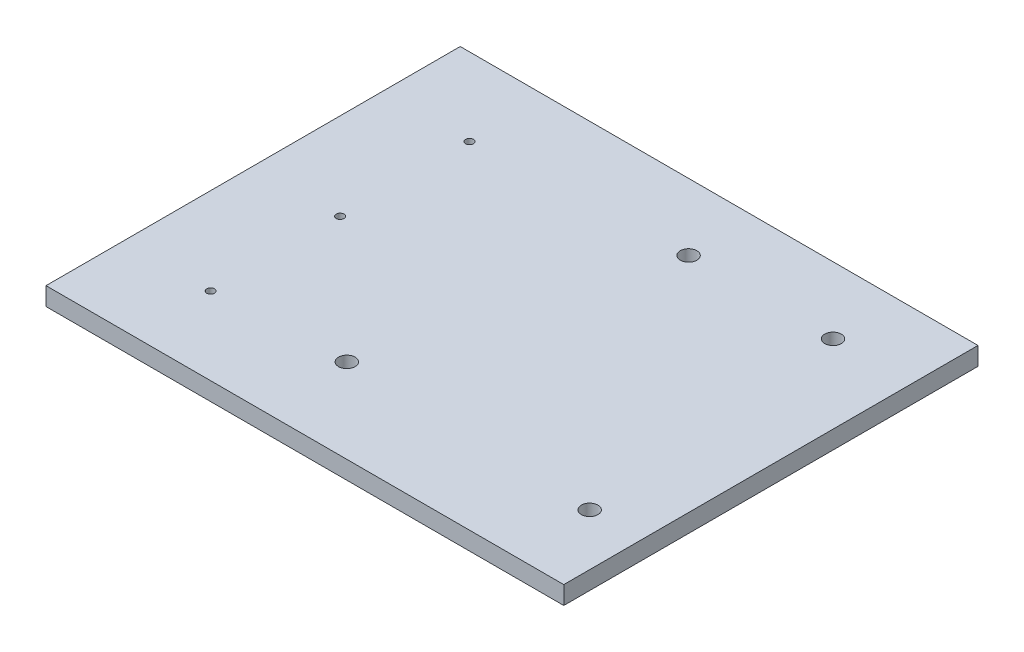
ISO-10303-21;
HEADER;
FILE_DESCRIPTION(('STEP AP214'),'2;1');
FILE_NAME('part.step','',(''),(''),'','','');
FILE_SCHEMA(('AUTOMOTIVE_DESIGN { 1 0 10303 214 1 1 1 1 }'));
ENDSEC;
DATA;
#1=APPLICATION_CONTEXT('core data for automotive mechanical design processes');
#2=APPLICATION_PROTOCOL_DEFINITION('international standard','automotive_design',2000,#1);
#3=PRODUCT_CONTEXT('',#1,'mechanical');
#4=PRODUCT('Part','Part','',(#3));
#5=PRODUCT_RELATED_PRODUCT_CATEGORY('part','',(#4));
#6=PRODUCT_DEFINITION_FORMATION('','',#4);
#7=PRODUCT_DEFINITION_CONTEXT('part definition',#1,'design');
#8=PRODUCT_DEFINITION('design','',#6,#7);
#9=PRODUCT_DEFINITION_SHAPE('','',#8);
#10=(LENGTH_UNIT() NAMED_UNIT(*) SI_UNIT(.MILLI.,.METRE.));
#11=(NAMED_UNIT(*) PLANE_ANGLE_UNIT() SI_UNIT($,.RADIAN.));
#12=(NAMED_UNIT(*) SI_UNIT($,.STERADIAN.) SOLID_ANGLE_UNIT());
#13=UNCERTAINTY_MEASURE_WITH_UNIT(LENGTH_MEASURE(1.E-05),#10,'distance_accuracy_value','');
#14=(GEOMETRIC_REPRESENTATION_CONTEXT(3) GLOBAL_UNCERTAINTY_ASSIGNED_CONTEXT((#13)) GLOBAL_UNIT_ASSIGNED_CONTEXT((#10,
#11,#12)) REPRESENTATION_CONTEXT('',''));
#15=CARTESIAN_POINT('',(0.,0.,0.));
#16=DIRECTION('',(0.,0.,1.));
#17=DIRECTION('',(1.,0.,0.));
#18=AXIS2_PLACEMENT_3D('',#15,#16,#17);
#19=CARTESIAN_POINT('',(50.,3.5,-40.));
#20=DIRECTION('',(-1.,0.,0.));
#21=DIRECTION('',(0.,0.,1.));
#22=AXIS2_PLACEMENT_3D('',#19,#20,#21);
#23=PLANE('',#22);
#24=DIRECTION('',(0.,0.,-1.));
#25=VECTOR('',#24,1.);
#26=CARTESIAN_POINT('',(50.,0.,-40.));
#27=LINE('',#26,#25);
#28=CARTESIAN_POINT('',(50.,0.,40.));
#29=VERTEX_POINT('',#28);
#30=CARTESIAN_POINT('',(50.,0.,-40.));
#31=VERTEX_POINT('',#30);
#32=EDGE_CURVE('E96',#29,#31,#27,.T.);
#33=ORIENTED_EDGE('',*,*,#32,.T.);
#34=DIRECTION('',(0.,-1.,0.));
#35=VECTOR('',#34,1.);
#36=CARTESIAN_POINT('',(50.,3.5,-40.));
#37=LINE('',#36,#35);
#38=CARTESIAN_POINT('',(50.,3.5,-40.));
#39=VERTEX_POINT('',#38);
#40=EDGE_CURVE('E11',#39,#31,#37,.T.);
#41=ORIENTED_EDGE('',*,*,#40,.F.);
#42=DIRECTION('',(0.,0.,-1.));
#43=VECTOR('',#42,1.);
#44=CARTESIAN_POINT('',(50.,3.5,-40.));
#45=LINE('',#44,#43);
#46=CARTESIAN_POINT('',(50.,3.5,40.));
#47=VERTEX_POINT('',#46);
#48=EDGE_CURVE('E84',#47,#39,#45,.T.);
#49=ORIENTED_EDGE('',*,*,#48,.F.);
#50=DIRECTION('',(0.,-1.,0.));
#51=VECTOR('',#50,1.);
#52=CARTESIAN_POINT('',(50.,3.5,40.));
#53=LINE('',#52,#51);
#54=EDGE_CURVE('E92',#47,#29,#53,.T.);
#55=ORIENTED_EDGE('',*,*,#54,.T.);
#56=EDGE_LOOP('',(#33,#41,#49,#55));
#57=FACE_BOUND('',#56,.T.);
#58=ADVANCED_FACE('F33',(#57),#23,.F.);
#59=CARTESIAN_POINT('',(-50.,3.5,-40.));
#60=DIRECTION('',(0.,0.,1.));
#61=DIRECTION('',(1.,0.,0.));
#62=AXIS2_PLACEMENT_3D('',#59,#60,#61);
#63=PLANE('',#62);
#64=DIRECTION('',(-1.,0.,0.));
#65=VECTOR('',#64,1.);
#66=CARTESIAN_POINT('',(-50.,0.,-40.));
#67=LINE('',#66,#65);
#68=CARTESIAN_POINT('',(-50.,0.,-40.));
#69=VERTEX_POINT('',#68);
#70=EDGE_CURVE('E88',#31,#69,#67,.T.);
#71=ORIENTED_EDGE('',*,*,#70,.T.);
#72=DIRECTION('',(0.,-1.,0.));
#73=VECTOR('',#72,1.);
#74=CARTESIAN_POINT('',(-50.,3.5,-40.));
#75=LINE('',#74,#73);
#76=CARTESIAN_POINT('',(-50.,3.5,-40.));
#77=VERTEX_POINT('',#76);
#78=EDGE_CURVE('E41',#77,#69,#75,.T.);
#79=ORIENTED_EDGE('',*,*,#78,.F.);
#80=DIRECTION('',(-1.,0.,0.));
#81=VECTOR('',#80,1.);
#82=CARTESIAN_POINT('',(-50.,3.5,-40.));
#83=LINE('',#82,#81);
#84=EDGE_CURVE('E79',#39,#77,#83,.T.);
#85=ORIENTED_EDGE('',*,*,#84,.F.);
#86=ORIENTED_EDGE('',*,*,#40,.T.);
#87=EDGE_LOOP('',(#71,#79,#85,#86));
#88=FACE_BOUND('',#87,.T.);
#89=ADVANCED_FACE('F87',(#88),#63,.F.);
#90=CARTESIAN_POINT('',(-50.,3.5,-40.));
#91=DIRECTION('',(1.,0.,0.));
#92=DIRECTION('',(0.,0.,-1.));
#93=AXIS2_PLACEMENT_3D('',#90,#91,#92);
#94=PLANE('',#93);
#95=DIRECTION('',(0.,0.,1.));
#96=VECTOR('',#95,1.);
#97=CARTESIAN_POINT('',(-50.,0.,-40.));
#98=LINE('',#97,#96);
#99=CARTESIAN_POINT('',(-50.,0.,40.));
#100=VERTEX_POINT('',#99);
#101=EDGE_CURVE('E66',#69,#100,#98,.T.);
#102=ORIENTED_EDGE('',*,*,#101,.T.);
#103=DIRECTION('',(0.,-1.,0.));
#104=VECTOR('',#103,1.);
#105=CARTESIAN_POINT('',(-50.,3.5,40.));
#106=LINE('',#105,#104);
#107=CARTESIAN_POINT('',(-50.,3.5,40.));
#108=VERTEX_POINT('',#107);
#109=EDGE_CURVE('E89',#108,#100,#106,.T.);
#110=ORIENTED_EDGE('',*,*,#109,.F.);
#111=DIRECTION('',(0.,0.,1.));
#112=VECTOR('',#111,1.);
#113=CARTESIAN_POINT('',(-50.,3.5,-40.));
#114=LINE('',#113,#112);
#115=EDGE_CURVE('E82',#77,#108,#114,.T.);
#116=ORIENTED_EDGE('',*,*,#115,.F.);
#117=ORIENTED_EDGE('',*,*,#78,.T.);
#118=EDGE_LOOP('',(#102,#110,#116,#117));
#119=FACE_BOUND('',#118,.T.);
#120=ADVANCED_FACE('F90',(#119),#94,.F.);
#121=CARTESIAN_POINT('',(-50.,3.5,40.));
#122=DIRECTION('',(0.,0.,-1.));
#123=DIRECTION('',(-1.,0.,0.));
#124=AXIS2_PLACEMENT_3D('',#121,#122,#123);
#125=PLANE('',#124);
#126=DIRECTION('',(1.,0.,0.));
#127=VECTOR('',#126,1.);
#128=CARTESIAN_POINT('',(-50.,0.,40.));
#129=LINE('',#128,#127);
#130=EDGE_CURVE('E72',#100,#29,#129,.T.);
#131=ORIENTED_EDGE('',*,*,#130,.T.);
#132=ORIENTED_EDGE('',*,*,#54,.F.);
#133=DIRECTION('',(1.,0.,0.));
#134=VECTOR('',#133,1.);
#135=CARTESIAN_POINT('',(-50.,3.5,40.));
#136=LINE('',#135,#134);
#137=EDGE_CURVE('E49',#108,#47,#136,.T.);
#138=ORIENTED_EDGE('',*,*,#137,.F.);
#139=ORIENTED_EDGE('',*,*,#109,.T.);
#140=EDGE_LOOP('',(#131,#132,#138,#139));
#141=FACE_BOUND('',#140,.T.);
#142=ADVANCED_FACE('F104',(#141),#125,.F.);
#143=CARTESIAN_POINT('',(0.,3.5,0.));
#144=DIRECTION('',(0.,1.,0.));
#145=DIRECTION('',(0.,0.,1.));
#146=AXIS2_PLACEMENT_3D('',#143,#144,#145);
#147=PLANE('',#146);
#148=CARTESIAN_POINT('',(-8.19999999999999,3.5,23.7));
#149=DIRECTION('',(0.,1.,0.));
#150=DIRECTION('',(0.,0.,1.));
#151=AXIS2_PLACEMENT_3D('',#148,#149,#150);
#152=CIRCLE('',#151,1.6);
#153=CARTESIAN_POINT('',(-8.19999999999999,3.5,25.3));
#154=VERTEX_POINT('',#153);
#155=EDGE_CURVE('E146',#154,#154,#152,.T.);
#156=ORIENTED_EDGE('',*,*,#155,.F.);
#157=EDGE_LOOP('',(#156));
#158=FACE_BOUND('',#157,.T.);
#159=CARTESIAN_POINT('',(7.,3.5,-27.1));
#160=DIRECTION('',(0.,1.,0.));
#161=DIRECTION('',(0.,0.,1.));
#162=AXIS2_PLACEMENT_3D('',#159,#160,#161);
#163=CIRCLE('',#162,1.6);
#164=CARTESIAN_POINT('',(7.,3.5,-25.5));
#165=VERTEX_POINT('',#164);
#166=EDGE_CURVE('E140',#165,#165,#163,.T.);
#167=ORIENTED_EDGE('',*,*,#166,.F.);
#168=EDGE_LOOP('',(#167));
#169=FACE_BOUND('',#168,.T.);
#170=CARTESIAN_POINT('',(34.9,3.5,-27.1));
#171=DIRECTION('',(0.,1.,0.));
#172=DIRECTION('',(0.,0.,1.));
#173=AXIS2_PLACEMENT_3D('',#170,#171,#172);
#174=CIRCLE('',#173,1.6);
#175=CARTESIAN_POINT('',(34.9,3.5,-25.5));
#176=VERTEX_POINT('',#175);
#177=EDGE_CURVE('E134',#176,#176,#174,.T.);
#178=ORIENTED_EDGE('',*,*,#177,.F.);
#179=EDGE_LOOP('',(#178));
#180=FACE_BOUND('',#179,.T.);
#181=CARTESIAN_POINT('',(-33.2,3.5,25.));
#182=DIRECTION('',(0.,1.,0.));
#183=DIRECTION('',(0.,0.,1.));
#184=AXIS2_PLACEMENT_3D('',#181,#182,#183);
#185=CIRCLE('',#184,0.749999999999999);
#186=CARTESIAN_POINT('',(-33.2,3.5,25.75));
#187=VERTEX_POINT('',#186);
#188=EDGE_CURVE('E128',#187,#187,#185,.T.);
#189=ORIENTED_EDGE('',*,*,#188,.F.);
#190=EDGE_LOOP('',(#189));
#191=FACE_BOUND('',#190,.T.);
#192=CARTESIAN_POINT('',(-33.2,3.5,-25.));
#193=DIRECTION('',(0.,1.,0.));
#194=DIRECTION('',(0.,0.,-1.));
#195=AXIS2_PLACEMENT_3D('',#192,#193,#194);
#196=CIRCLE('',#195,0.749999999999999);
#197=CARTESIAN_POINT('',(-33.2,3.5,-25.75));
#198=VERTEX_POINT('',#197);
#199=EDGE_CURVE('E122',#198,#198,#196,.T.);
#200=ORIENTED_EDGE('',*,*,#199,.F.);
#201=EDGE_LOOP('',(#200));
#202=FACE_BOUND('',#201,.T.);
#203=CARTESIAN_POINT('',(-33.2,3.5,0.));
#204=DIRECTION('',(0.,1.,0.));
#205=DIRECTION('',(0.,0.,1.));
#206=AXIS2_PLACEMENT_3D('',#203,#204,#205);
#207=CIRCLE('',#206,0.749999999999999);
#208=CARTESIAN_POINT('',(-33.2,3.5,0.750000000000006));
#209=VERTEX_POINT('',#208);
#210=EDGE_CURVE('E116',#209,#209,#207,.T.);
#211=ORIENTED_EDGE('',*,*,#210,.F.);
#212=EDGE_LOOP('',(#211));
#213=FACE_BOUND('',#212,.T.);
#214=CARTESIAN_POINT('',(40.,3.5,25.));
#215=DIRECTION('',(0.,1.,0.));
#216=DIRECTION('',(0.,0.,1.));
#217=AXIS2_PLACEMENT_3D('',#214,#215,#216);
#218=CIRCLE('',#217,1.6);
#219=CARTESIAN_POINT('',(40.,3.5,26.6));
#220=VERTEX_POINT('',#219);
#221=EDGE_CURVE('E110',#220,#220,#218,.T.);
#222=ORIENTED_EDGE('',*,*,#221,.F.);
#223=EDGE_LOOP('',(#222));
#224=FACE_BOUND('',#223,.T.);
#225=ORIENTED_EDGE('',*,*,#48,.T.);
#226=ORIENTED_EDGE('',*,*,#84,.T.);
#227=ORIENTED_EDGE('',*,*,#115,.T.);
#228=ORIENTED_EDGE('',*,*,#137,.T.);
#229=EDGE_LOOP('',(#225,#226,#227,#228));
#230=FACE_BOUND('',#229,.T.);
#231=ADVANCED_FACE('F80',(#158,#169,#180,#191,#202,#213,#224,#230),#147,.T.);
#232=CARTESIAN_POINT('',(0.,0.,0.));
#233=DIRECTION('',(0.,1.,0.));
#234=DIRECTION('',(0.,0.,1.));
#235=AXIS2_PLACEMENT_3D('',#232,#233,#234);
#236=PLANE('',#235);
#237=CARTESIAN_POINT('',(-8.19999999999999,0.,23.7));
#238=DIRECTION('',(0.,1.,0.));
#239=DIRECTION('',(0.,0.,1.));
#240=AXIS2_PLACEMENT_3D('',#237,#238,#239);
#241=CIRCLE('',#240,1.6);
#242=CARTESIAN_POINT('',(-8.19999999999999,0.,25.3));
#243=VERTEX_POINT('',#242);
#244=EDGE_CURVE('E113',#243,#243,#241,.T.);
#245=ORIENTED_EDGE('',*,*,#244,.T.);
#246=EDGE_LOOP('',(#245));
#247=FACE_BOUND('',#246,.T.);
#248=CARTESIAN_POINT('',(7.,0.,-27.1));
#249=DIRECTION('',(0.,1.,0.));
#250=DIRECTION('',(0.,0.,1.));
#251=AXIS2_PLACEMENT_3D('',#248,#249,#250);
#252=CIRCLE('',#251,1.6);
#253=CARTESIAN_POINT('',(7.,0.,-25.5));
#254=VERTEX_POINT('',#253);
#255=EDGE_CURVE('E143',#254,#254,#252,.T.);
#256=ORIENTED_EDGE('',*,*,#255,.T.);
#257=EDGE_LOOP('',(#256));
#258=FACE_BOUND('',#257,.T.);
#259=CARTESIAN_POINT('',(34.9,0.,-27.1));
#260=DIRECTION('',(0.,1.,0.));
#261=DIRECTION('',(0.,0.,1.));
#262=AXIS2_PLACEMENT_3D('',#259,#260,#261);
#263=CIRCLE('',#262,1.6);
#264=CARTESIAN_POINT('',(34.9,0.,-25.5));
#265=VERTEX_POINT('',#264);
#266=EDGE_CURVE('E137',#265,#265,#263,.T.);
#267=ORIENTED_EDGE('',*,*,#266,.T.);
#268=EDGE_LOOP('',(#267));
#269=FACE_BOUND('',#268,.T.);
#270=CARTESIAN_POINT('',(-33.2,0.,25.));
#271=DIRECTION('',(0.,1.,0.));
#272=DIRECTION('',(0.,0.,1.));
#273=AXIS2_PLACEMENT_3D('',#270,#271,#272);
#274=CIRCLE('',#273,0.749999999999999);
#275=CARTESIAN_POINT('',(-33.2,0.,25.75));
#276=VERTEX_POINT('',#275);
#277=EDGE_CURVE('E131',#276,#276,#274,.T.);
#278=ORIENTED_EDGE('',*,*,#277,.T.);
#279=EDGE_LOOP('',(#278));
#280=FACE_BOUND('',#279,.T.);
#281=CARTESIAN_POINT('',(-33.2,0.,-25.));
#282=DIRECTION('',(0.,1.,0.));
#283=DIRECTION('',(0.,0.,-1.));
#284=AXIS2_PLACEMENT_3D('',#281,#282,#283);
#285=CIRCLE('',#284,0.749999999999999);
#286=CARTESIAN_POINT('',(-33.2,0.,-25.75));
#287=VERTEX_POINT('',#286);
#288=EDGE_CURVE('E125',#287,#287,#285,.T.);
#289=ORIENTED_EDGE('',*,*,#288,.T.);
#290=EDGE_LOOP('',(#289));
#291=FACE_BOUND('',#290,.T.);
#292=CARTESIAN_POINT('',(-33.2,0.,0.));
#293=DIRECTION('',(0.,1.,0.));
#294=DIRECTION('',(0.,0.,1.));
#295=AXIS2_PLACEMENT_3D('',#292,#293,#294);
#296=CIRCLE('',#295,0.749999999999999);
#297=CARTESIAN_POINT('',(-33.2,0.,0.750000000000006));
#298=VERTEX_POINT('',#297);
#299=EDGE_CURVE('E119',#298,#298,#296,.T.);
#300=ORIENTED_EDGE('',*,*,#299,.T.);
#301=EDGE_LOOP('',(#300));
#302=FACE_BOUND('',#301,.T.);
#303=CARTESIAN_POINT('',(40.,0.,25.));
#304=DIRECTION('',(0.,1.,0.));
#305=DIRECTION('',(0.,0.,1.));
#306=AXIS2_PLACEMENT_3D('',#303,#304,#305);
#307=CIRCLE('',#306,1.6);
#308=CARTESIAN_POINT('',(40.,0.,26.6));
#309=VERTEX_POINT('',#308);
#310=EDGE_CURVE('E99',#309,#309,#307,.T.);
#311=ORIENTED_EDGE('',*,*,#310,.T.);
#312=EDGE_LOOP('',(#311));
#313=FACE_BOUND('',#312,.T.);
#314=ORIENTED_EDGE('',*,*,#32,.F.);
#315=ORIENTED_EDGE('',*,*,#130,.F.);
#316=ORIENTED_EDGE('',*,*,#101,.F.);
#317=ORIENTED_EDGE('',*,*,#70,.F.);
#318=EDGE_LOOP('',(#314,#315,#316,#317));
#319=FACE_BOUND('',#318,.T.);
#320=ADVANCED_FACE('F107',(#247,#258,#269,#280,#291,#302,#313,#319),#236,.F.);
#321=CARTESIAN_POINT('',(40.,0.,25.));
#322=DIRECTION('',(0.,1.,0.));
#323=DIRECTION('',(0.,0.,1.));
#324=AXIS2_PLACEMENT_3D('',#321,#322,#323);
#325=CYLINDRICAL_SURFACE('',#324,1.6);
#326=ORIENTED_EDGE('',*,*,#310,.F.);
#327=EDGE_LOOP('',(#326));
#328=FACE_BOUND('',#327,.T.);
#329=ORIENTED_EDGE('',*,*,#221,.T.);
#330=EDGE_LOOP('',(#329));
#331=FACE_BOUND('',#330,.T.);
#332=ADVANCED_FACE('F176',(#328,#331),#325,.F.);
#333=CARTESIAN_POINT('',(-33.2,0.,0.));
#334=DIRECTION('',(0.,1.,0.));
#335=DIRECTION('',(0.,0.,1.));
#336=AXIS2_PLACEMENT_3D('',#333,#334,#335);
#337=CYLINDRICAL_SURFACE('',#336,0.749999999999999);
#338=ORIENTED_EDGE('',*,*,#299,.F.);
#339=EDGE_LOOP('',(#338));
#340=FACE_BOUND('',#339,.T.);
#341=ORIENTED_EDGE('',*,*,#210,.T.);
#342=EDGE_LOOP('',(#341));
#343=FACE_BOUND('',#342,.T.);
#344=ADVANCED_FACE('F178',(#340,#343),#337,.F.);
#345=CARTESIAN_POINT('',(-33.2,0.,-25.));
#346=DIRECTION('',(0.,1.,0.));
#347=DIRECTION('',(0.,0.,1.));
#348=AXIS2_PLACEMENT_3D('',#345,#346,#347);
#349=CYLINDRICAL_SURFACE('',#348,0.749999999999999);
#350=ORIENTED_EDGE('',*,*,#288,.F.);
#351=EDGE_LOOP('',(#350));
#352=FACE_BOUND('',#351,.T.);
#353=ORIENTED_EDGE('',*,*,#199,.T.);
#354=EDGE_LOOP('',(#353));
#355=FACE_BOUND('',#354,.T.);
#356=ADVANCED_FACE('F185',(#352,#355),#349,.F.);
#357=CARTESIAN_POINT('',(-33.2,0.,25.));
#358=DIRECTION('',(0.,1.,0.));
#359=DIRECTION('',(0.,0.,1.));
#360=AXIS2_PLACEMENT_3D('',#357,#358,#359);
#361=CYLINDRICAL_SURFACE('',#360,0.749999999999999);
#362=ORIENTED_EDGE('',*,*,#277,.F.);
#363=EDGE_LOOP('',(#362));
#364=FACE_BOUND('',#363,.T.);
#365=ORIENTED_EDGE('',*,*,#188,.T.);
#366=EDGE_LOOP('',(#365));
#367=FACE_BOUND('',#366,.T.);
#368=ADVANCED_FACE('F231',(#364,#367),#361,.F.);
#369=CARTESIAN_POINT('',(34.9,0.,-27.1));
#370=DIRECTION('',(0.,1.,0.));
#371=DIRECTION('',(0.,0.,1.));
#372=AXIS2_PLACEMENT_3D('',#369,#370,#371);
#373=CYLINDRICAL_SURFACE('',#372,1.6);
#374=ORIENTED_EDGE('',*,*,#266,.F.);
#375=EDGE_LOOP('',(#374));
#376=FACE_BOUND('',#375,.T.);
#377=ORIENTED_EDGE('',*,*,#177,.T.);
#378=EDGE_LOOP('',(#377));
#379=FACE_BOUND('',#378,.T.);
#380=ADVANCED_FACE('F241',(#376,#379),#373,.F.);
#381=CARTESIAN_POINT('',(7.,0.,-27.1));
#382=DIRECTION('',(0.,1.,0.));
#383=DIRECTION('',(0.,0.,1.));
#384=AXIS2_PLACEMENT_3D('',#381,#382,#383);
#385=CYLINDRICAL_SURFACE('',#384,1.6);
#386=ORIENTED_EDGE('',*,*,#255,.F.);
#387=EDGE_LOOP('',(#386));
#388=FACE_BOUND('',#387,.T.);
#389=ORIENTED_EDGE('',*,*,#166,.T.);
#390=EDGE_LOOP('',(#389));
#391=FACE_BOUND('',#390,.T.);
#392=ADVANCED_FACE('F157',(#388,#391),#385,.F.);
#393=CARTESIAN_POINT('',(-8.19999999999999,0.,23.7));
#394=DIRECTION('',(0.,1.,0.));
#395=DIRECTION('',(0.,0.,1.));
#396=AXIS2_PLACEMENT_3D('',#393,#394,#395);
#397=CYLINDRICAL_SURFACE('',#396,1.6);
#398=ORIENTED_EDGE('',*,*,#244,.F.);
#399=EDGE_LOOP('',(#398));
#400=FACE_BOUND('',#399,.T.);
#401=ORIENTED_EDGE('',*,*,#155,.T.);
#402=EDGE_LOOP('',(#401));
#403=FACE_BOUND('',#402,.T.);
#404=ADVANCED_FACE('F154',(#400,#403),#397,.F.);
#405=CLOSED_SHELL('',(#58,#89,#120,#142,#231,#320,#332,#344,#356,#368,#380,#392,#404));
#406=MANIFOLD_SOLID_BREP('B2',#405);
#407=ADVANCED_BREP_SHAPE_REPRESENTATION('',(#18,#406),#14);
#408=SHAPE_DEFINITION_REPRESENTATION(#9,#407);
ENDSEC;
END-ISO-10303-21;
